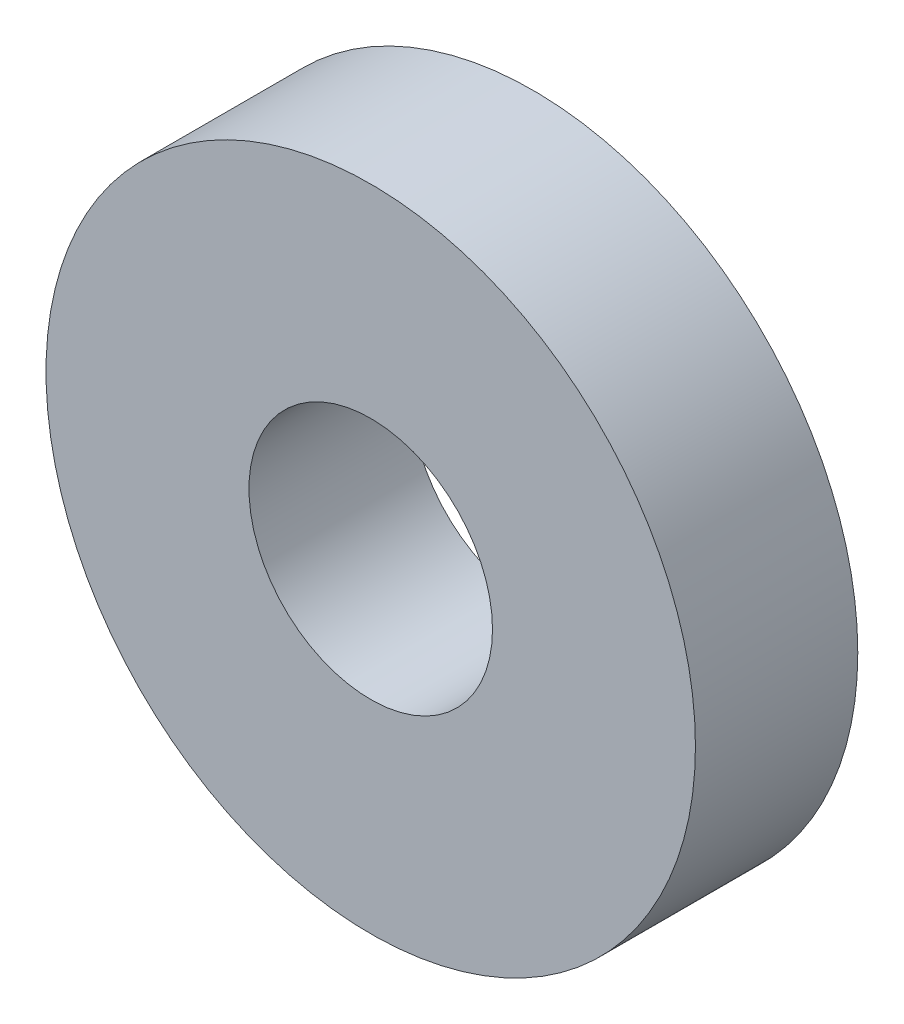
ISO-10303-21;
HEADER;
FILE_DESCRIPTION(('STEP AP214'),'2;1');
FILE_NAME('part.step','',(''),(''),'','','');
FILE_SCHEMA(('AUTOMOTIVE_DESIGN { 1 0 10303 214 1 1 1 1 }'));
ENDSEC;
DATA;
#1=APPLICATION_CONTEXT('core data for automotive mechanical design processes');
#2=APPLICATION_PROTOCOL_DEFINITION('international standard','automotive_design',2000,#1);
#3=PRODUCT_CONTEXT('',#1,'mechanical');
#4=PRODUCT('Part','Part','',(#3));
#5=PRODUCT_RELATED_PRODUCT_CATEGORY('part','',(#4));
#6=PRODUCT_DEFINITION_FORMATION('','',#4);
#7=PRODUCT_DEFINITION_CONTEXT('part definition',#1,'design');
#8=PRODUCT_DEFINITION('design','',#6,#7);
#9=PRODUCT_DEFINITION_SHAPE('','',#8);
#10=(LENGTH_UNIT() NAMED_UNIT(*) SI_UNIT(.MILLI.,.METRE.));
#11=(NAMED_UNIT(*) PLANE_ANGLE_UNIT() SI_UNIT($,.RADIAN.));
#12=(NAMED_UNIT(*) SI_UNIT($,.STERADIAN.) SOLID_ANGLE_UNIT());
#13=UNCERTAINTY_MEASURE_WITH_UNIT(LENGTH_MEASURE(1.E-05),#10,'distance_accuracy_value','');
#14=(GEOMETRIC_REPRESENTATION_CONTEXT(3) GLOBAL_UNCERTAINTY_ASSIGNED_CONTEXT((#13)) GLOBAL_UNIT_ASSIGNED_CONTEXT((#10,
#11,#12)) REPRESENTATION_CONTEXT('',''));
#15=CARTESIAN_POINT('',(0.,0.,0.));
#16=DIRECTION('',(0.,0.,1.));
#17=DIRECTION('',(1.,0.,0.));
#18=AXIS2_PLACEMENT_3D('',#15,#16,#17);
#19=CARTESIAN_POINT('',(0.,0.,3.175));
#20=DIRECTION('',(0.,0.,1.));
#21=DIRECTION('',(1.,0.,0.));
#22=AXIS2_PLACEMENT_3D('',#19,#20,#21);
#23=PLANE('',#22);
#24=CARTESIAN_POINT('',(0.,0.,3.175));
#25=DIRECTION('',(0.,0.,1.));
#26=DIRECTION('',(1.,0.,0.));
#27=AXIS2_PLACEMENT_3D('',#24,#25,#26);
#28=CIRCLE('',#27,6.35);
#29=CARTESIAN_POINT('',(6.35,0.,3.175));
#30=VERTEX_POINT('',#29);
#31=EDGE_CURVE('E10',#30,#30,#28,.T.);
#32=ORIENTED_EDGE('',*,*,#31,.T.);
#33=EDGE_LOOP('',(#32));
#34=FACE_BOUND('',#33,.T.);
#35=CARTESIAN_POINT('',(0.,0.,3.175));
#36=DIRECTION('',(0.,0.,1.));
#37=DIRECTION('',(1.,0.,0.));
#38=AXIS2_PLACEMENT_3D('',#35,#36,#37);
#39=CIRCLE('',#38,2.38125);
#40=CARTESIAN_POINT('',(2.38125,0.,3.175));
#41=VERTEX_POINT('',#40);
#42=EDGE_CURVE('E42',#41,#41,#39,.T.);
#43=ORIENTED_EDGE('',*,*,#42,.F.);
#44=EDGE_LOOP('',(#43));
#45=FACE_BOUND('',#44,.T.);
#46=ADVANCED_FACE('F31',(#34,#45),#23,.T.);
#47=CARTESIAN_POINT('',(0.,0.,0.));
#48=DIRECTION('',(0.,0.,1.));
#49=DIRECTION('',(1.,0.,0.));
#50=AXIS2_PLACEMENT_3D('',#47,#48,#49);
#51=PLANE('',#50);
#52=CARTESIAN_POINT('',(0.,0.,0.));
#53=DIRECTION('',(0.,0.,1.));
#54=DIRECTION('',(1.,0.,0.));
#55=AXIS2_PLACEMENT_3D('',#52,#53,#54);
#56=CIRCLE('',#55,6.35);
#57=CARTESIAN_POINT('',(6.35,0.,0.));
#58=VERTEX_POINT('',#57);
#59=EDGE_CURVE('E35',#58,#58,#56,.T.);
#60=ORIENTED_EDGE('',*,*,#59,.F.);
#61=EDGE_LOOP('',(#60));
#62=FACE_BOUND('',#61,.T.);
#63=CARTESIAN_POINT('',(0.,0.,0.));
#64=DIRECTION('',(0.,0.,1.));
#65=DIRECTION('',(1.,0.,0.));
#66=AXIS2_PLACEMENT_3D('',#63,#64,#65);
#67=CIRCLE('',#66,2.38125);
#68=CARTESIAN_POINT('',(2.38125,0.,0.));
#69=VERTEX_POINT('',#68);
#70=EDGE_CURVE('E44',#69,#69,#67,.T.);
#71=ORIENTED_EDGE('',*,*,#70,.T.);
#72=EDGE_LOOP('',(#71));
#73=FACE_BOUND('',#72,.T.);
#74=ADVANCED_FACE('F54',(#62,#73),#51,.F.);
#75=CARTESIAN_POINT('',(0.,0.,3.175));
#76=DIRECTION('',(0.,0.,-1.));
#77=DIRECTION('',(-1.,0.,0.));
#78=AXIS2_PLACEMENT_3D('',#75,#76,#77);
#79=CYLINDRICAL_SURFACE('',#78,6.35);
#80=ORIENTED_EDGE('',*,*,#31,.F.);
#81=EDGE_LOOP('',(#80));
#82=FACE_BOUND('',#81,.T.);
#83=ORIENTED_EDGE('',*,*,#59,.T.);
#84=EDGE_LOOP('',(#83));
#85=FACE_BOUND('',#84,.T.);
#86=ADVANCED_FACE('F33',(#82,#85),#79,.T.);
#87=CARTESIAN_POINT('',(0.,0.,3.175));
#88=DIRECTION('',(0.,0.,-1.));
#89=DIRECTION('',(-1.,0.,0.));
#90=AXIS2_PLACEMENT_3D('',#87,#88,#89);
#91=CYLINDRICAL_SURFACE('',#90,2.38125);
#92=ORIENTED_EDGE('',*,*,#42,.T.);
#93=EDGE_LOOP('',(#92));
#94=FACE_BOUND('',#93,.T.);
#95=ORIENTED_EDGE('',*,*,#70,.F.);
#96=EDGE_LOOP('',(#95));
#97=FACE_BOUND('',#96,.T.);
#98=ADVANCED_FACE('F50',(#94,#97),#91,.F.);
#99=CLOSED_SHELL('',(#46,#74,#86,#98));
#100=MANIFOLD_SOLID_BREP('B2',#99);
#101=ADVANCED_BREP_SHAPE_REPRESENTATION('',(#18,#100),#14);
#102=SHAPE_DEFINITION_REPRESENTATION(#9,#101);
ENDSEC;
END-ISO-10303-21;
